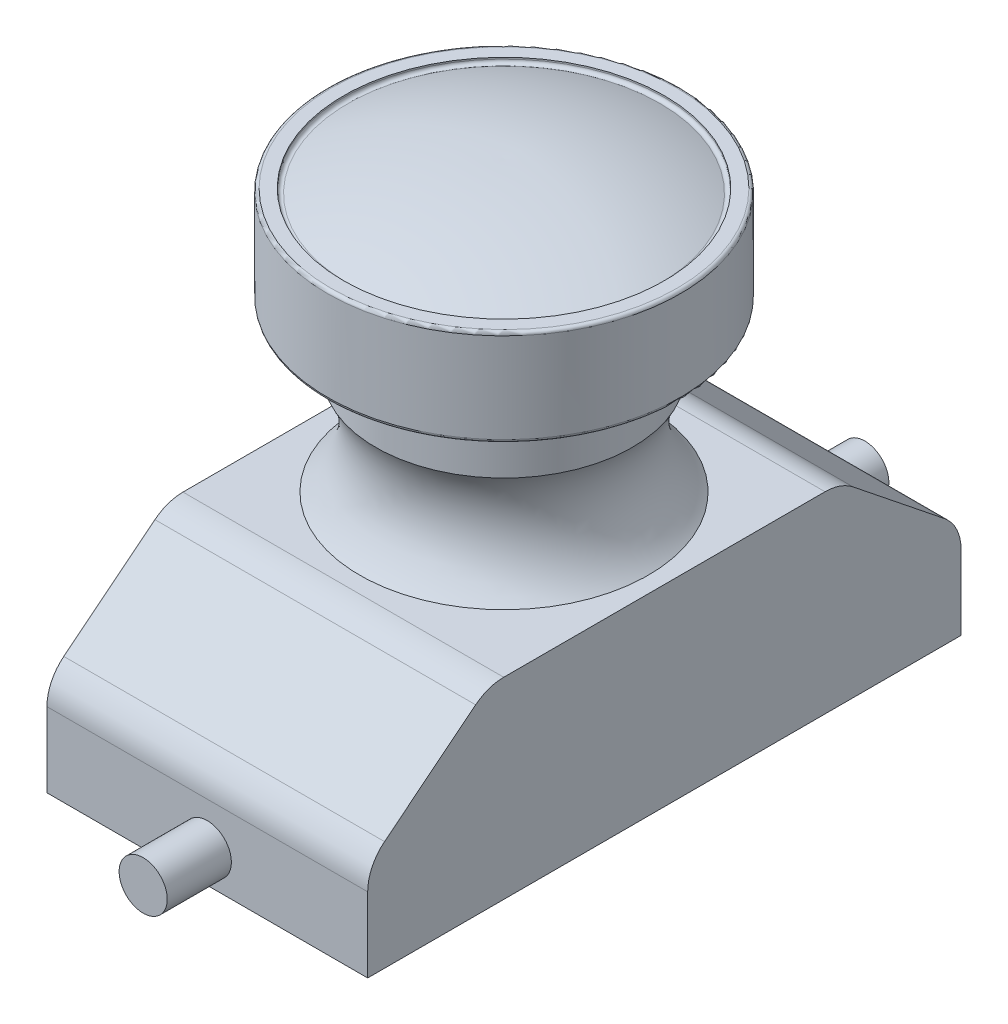
ISO-10303-21;
HEADER;
FILE_DESCRIPTION(('STEP AP214'),'2;1');
FILE_NAME('part.step','',(''),(''),'','','');
FILE_SCHEMA(('AUTOMOTIVE_DESIGN { 1 0 10303 214 1 1 1 1 }'));
ENDSEC;
DATA;
#1=APPLICATION_CONTEXT('core data for automotive mechanical design processes');
#2=APPLICATION_PROTOCOL_DEFINITION('international standard','automotive_design',2000,#1);
#3=PRODUCT_CONTEXT('',#1,'mechanical');
#4=PRODUCT('Part','Part','',(#3));
#5=PRODUCT_RELATED_PRODUCT_CATEGORY('part','',(#4));
#6=PRODUCT_DEFINITION_FORMATION('','',#4);
#7=PRODUCT_DEFINITION_CONTEXT('part definition',#1,'design');
#8=PRODUCT_DEFINITION('design','',#6,#7);
#9=PRODUCT_DEFINITION_SHAPE('','',#8);
#10=(LENGTH_UNIT() NAMED_UNIT(*) SI_UNIT(.MILLI.,.METRE.));
#11=(NAMED_UNIT(*) PLANE_ANGLE_UNIT() SI_UNIT($,.RADIAN.));
#12=(NAMED_UNIT(*) SI_UNIT($,.STERADIAN.) SOLID_ANGLE_UNIT());
#13=UNCERTAINTY_MEASURE_WITH_UNIT(LENGTH_MEASURE(1.E-05),#10,'distance_accuracy_value','');
#14=(GEOMETRIC_REPRESENTATION_CONTEXT(3) GLOBAL_UNCERTAINTY_ASSIGNED_CONTEXT((#13)) GLOBAL_UNIT_ASSIGNED_CONTEXT((#10,
#11,#12)) REPRESENTATION_CONTEXT('',''));
#15=CARTESIAN_POINT('',(0.,0.,0.));
#16=DIRECTION('',(0.,0.,1.));
#17=DIRECTION('',(1.,0.,0.));
#18=AXIS2_PLACEMENT_3D('',#15,#16,#17);
#19=CARTESIAN_POINT('',(5.,0.,0.));
#20=DIRECTION('',(0.,1.,0.));
#21=DIRECTION('',(0.,0.,1.));
#22=AXIS2_PLACEMENT_3D('',#19,#20,#21);
#23=PLANE('',#22);
#24=DIRECTION('',(0.,0.,-1.));
#25=VECTOR('',#24,1.);
#26=CARTESIAN_POINT('',(-5.,0.,0.));
#27=LINE('',#26,#25);
#28=CARTESIAN_POINT('',(-5.,0.,9.25));
#29=VERTEX_POINT('',#28);
#30=CARTESIAN_POINT('',(-5.,0.,-9.25));
#31=VERTEX_POINT('',#30);
#32=EDGE_CURVE('E206',#29,#31,#27,.T.);
#33=ORIENTED_EDGE('',*,*,#32,.T.);
#34=DIRECTION('',(-1.,0.,0.));
#35=VECTOR('',#34,1.);
#36=CARTESIAN_POINT('',(5.,0.,-9.25));
#37=LINE('',#36,#35);
#38=CARTESIAN_POINT('',(5.,0.,-9.25));
#39=VERTEX_POINT('',#38);
#40=EDGE_CURVE('E224',#39,#31,#37,.T.);
#41=ORIENTED_EDGE('',*,*,#40,.F.);
#42=DIRECTION('',(0.,0.,-1.));
#43=VECTOR('',#42,1.);
#44=CARTESIAN_POINT('',(5.,0.,0.));
#45=LINE('',#44,#43);
#46=CARTESIAN_POINT('',(5.,0.,9.25));
#47=VERTEX_POINT('',#46);
#48=EDGE_CURVE('E221',#47,#39,#45,.T.);
#49=ORIENTED_EDGE('',*,*,#48,.F.);
#50=DIRECTION('',(-1.,0.,0.));
#51=VECTOR('',#50,1.);
#52=CARTESIAN_POINT('',(5.,0.,9.25));
#53=LINE('',#52,#51);
#54=EDGE_CURVE('E199',#47,#29,#53,.T.);
#55=ORIENTED_EDGE('',*,*,#54,.T.);
#56=EDGE_LOOP('',(#33,#41,#49,#55));
#57=FACE_BOUND('',#56,.T.);
#58=ADVANCED_FACE('F34',(#57),#23,.F.);
#59=CARTESIAN_POINT('',(5.,0.,-9.25));
#60=DIRECTION('',(0.,0.,1.));
#61=DIRECTION('',(1.,0.,0.));
#62=AXIS2_PLACEMENT_3D('',#59,#60,#61);
#63=PLANE('',#62);
#64=CARTESIAN_POINT('',(0.,1.,-9.25));
#65=DIRECTION('',(0.,0.,1.));
#66=DIRECTION('',(1.,0.,0.));
#67=AXIS2_PLACEMENT_3D('',#64,#65,#66);
#68=CIRCLE('',#67,0.75);
#69=CARTESIAN_POINT('',(0.75,1.,-9.25));
#70=VERTEX_POINT('',#69);
#71=EDGE_CURVE('E11',#70,#70,#68,.F.);
#72=ORIENTED_EDGE('',*,*,#71,.F.);
#73=EDGE_LOOP('',(#72));
#74=FACE_BOUND('',#73,.T.);
#75=DIRECTION('',(0.,1.,0.));
#76=VECTOR('',#75,1.);
#77=CARTESIAN_POINT('',(-5.,0.,-9.25));
#78=LINE('',#77,#76);
#79=CARTESIAN_POINT('',(-5.,2.3271252135188,-9.25));
#80=VERTEX_POINT('',#79);
#81=EDGE_CURVE('E208',#31,#80,#78,.T.);
#82=ORIENTED_EDGE('',*,*,#81,.T.);
#83=DIRECTION('',(-1.,0.,0.));
#84=VECTOR('',#83,1.);
#85=CARTESIAN_POINT('',(5.,2.3271252135188,-9.25));
#86=LINE('',#85,#84);
#87=CARTESIAN_POINT('',(5.,2.3271252135188,-9.25));
#88=VERTEX_POINT('',#87);
#89=EDGE_CURVE('E174',#80,#88,#86,.F.);
#90=ORIENTED_EDGE('',*,*,#89,.T.);
#91=DIRECTION('',(0.,1.,0.));
#92=VECTOR('',#91,1.);
#93=CARTESIAN_POINT('',(5.,0.,-9.25));
#94=LINE('',#93,#92);
#95=EDGE_CURVE('E258',#39,#88,#94,.T.);
#96=ORIENTED_EDGE('',*,*,#95,.F.);
#97=ORIENTED_EDGE('',*,*,#40,.T.);
#98=EDGE_LOOP('',(#82,#90,#96,#97));
#99=FACE_BOUND('',#98,.T.);
#100=ADVANCED_FACE('F132',(#74,#99),#63,.F.);
#101=CARTESIAN_POINT('',(5.,6.34146341463415,-5.07317073170731));
#102=DIRECTION('',(0.,0.780868809443031,-0.624695047554424));
#103=DIRECTION('',(0.,0.624695047554424,0.780868809443031));
#104=AXIS2_PLACEMENT_3D('',#101,#102,#103);
#105=PLANE('',#104);
#106=DIRECTION('',(0.,-0.624695047554424,-0.780868809443031));
#107=VECTOR('',#106,1.);
#108=CARTESIAN_POINT('',(5.,6.34146341463415,-5.07317073170731));
#109=LINE('',#108,#107);
#110=CARTESIAN_POINT('',(5.,5.69321633322024,-5.8834795834747));
#111=VERTEX_POINT('',#110);
#112=CARTESIAN_POINT('',(5.,3.42034154673905,-8.72457306657619));
#113=VERTEX_POINT('',#112);
#114=EDGE_CURVE('E202',#111,#113,#109,.T.);
#115=ORIENTED_EDGE('',*,*,#114,.T.);
#116=DIRECTION('',(-1.,0.,0.));
#117=VECTOR('',#116,1.);
#118=CARTESIAN_POINT('',(-5.,3.42034154673905,-8.72457306657619));
#119=LINE('',#118,#117);
#120=CARTESIAN_POINT('',(-5.,3.42034154673905,-8.72457306657619));
#121=VERTEX_POINT('',#120);
#122=EDGE_CURVE('E246',#113,#121,#119,.T.);
#123=ORIENTED_EDGE('',*,*,#122,.T.);
#124=DIRECTION('',(0.,-0.624695047554424,-0.780868809443031));
#125=VECTOR('',#124,1.);
#126=CARTESIAN_POINT('',(-5.,6.34146341463415,-5.07317073170731));
#127=LINE('',#126,#125);
#128=CARTESIAN_POINT('',(-5.,5.69321633322024,-5.8834795834747));
#129=VERTEX_POINT('',#128);
#130=EDGE_CURVE('E212',#129,#121,#127,.T.);
#131=ORIENTED_EDGE('',*,*,#130,.F.);
#132=DIRECTION('',(-1.,0.,0.));
#133=VECTOR('',#132,1.);
#134=CARTESIAN_POINT('',(5.,5.69321633322024,-5.8834795834747));
#135=LINE('',#134,#133);
#136=EDGE_CURVE('E244',#129,#111,#135,.F.);
#137=ORIENTED_EDGE('',*,*,#136,.T.);
#138=EDGE_LOOP('',(#115,#123,#131,#137));
#139=FACE_BOUND('',#138,.T.);
#140=ADVANCED_FACE('F138',(#139),#105,.T.);
#141=CARTESIAN_POINT('',(5.,6.,0.));
#142=DIRECTION('',(0.,1.,0.));
#143=DIRECTION('',(0.,0.,1.));
#144=AXIS2_PLACEMENT_3D('',#141,#142,#143);
#145=PLANE('',#144);
#146=CARTESIAN_POINT('',(0.,6.,0.));
#147=DIRECTION('',(0.,-1.,0.));
#148=DIRECTION('',(0.,0.,-1.));
#149=AXIS2_PLACEMENT_3D('',#146,#147,#148);
#150=CIRCLE('',#149,4.5);
#151=CARTESIAN_POINT('',(0.,6.,-4.5));
#152=VERTEX_POINT('',#151);
#153=EDGE_CURVE('E293',#152,#152,#150,.T.);
#154=ORIENTED_EDGE('',*,*,#153,.T.);
#155=EDGE_LOOP('',(#154));
#156=FACE_BOUND('',#155,.T.);
#157=DIRECTION('',(0.,0.,-1.));
#158=VECTOR('',#157,1.);
#159=CARTESIAN_POINT('',(5.,6.,0.));
#160=LINE('',#159,#158);
#161=CARTESIAN_POINT('',(5.,6.,5.0089065168985));
#162=VERTEX_POINT('',#161);
#163=CARTESIAN_POINT('',(5.,6.,-5.0089065168985));
#164=VERTEX_POINT('',#163);
#165=EDGE_CURVE('E197',#162,#164,#160,.T.);
#166=ORIENTED_EDGE('',*,*,#165,.T.);
#167=DIRECTION('',(-1.,0.,0.));
#168=VECTOR('',#167,1.);
#169=CARTESIAN_POINT('',(5.,6.,-5.0089065168985));
#170=LINE('',#169,#168);
#171=CARTESIAN_POINT('',(-5.,6.,-5.0089065168985));
#172=VERTEX_POINT('',#171);
#173=EDGE_CURVE('E181',#164,#172,#170,.T.);
#174=ORIENTED_EDGE('',*,*,#173,.T.);
#175=DIRECTION('',(0.,0.,-1.));
#176=VECTOR('',#175,1.);
#177=CARTESIAN_POINT('',(-5.,6.,0.));
#178=LINE('',#177,#176);
#179=CARTESIAN_POINT('',(-5.,6.,5.0089065168985));
#180=VERTEX_POINT('',#179);
#181=EDGE_CURVE('E215',#180,#172,#178,.T.);
#182=ORIENTED_EDGE('',*,*,#181,.F.);
#183=DIRECTION('',(-1.,0.,0.));
#184=VECTOR('',#183,1.);
#185=CARTESIAN_POINT('',(5.,6.,5.0089065168985));
#186=LINE('',#185,#184);
#187=EDGE_CURVE('E179',#180,#162,#186,.F.);
#188=ORIENTED_EDGE('',*,*,#187,.T.);
#189=EDGE_LOOP('',(#166,#174,#182,#188));
#190=FACE_BOUND('',#189,.T.);
#191=ADVANCED_FACE('F276',(#156,#190),#145,.T.);
#192=CARTESIAN_POINT('',(5.,6.34146341463415,5.07317073170731));
#193=DIRECTION('',(0.,0.780868809443031,0.624695047554424));
#194=DIRECTION('',(0.,-0.624695047554424,0.780868809443031));
#195=AXIS2_PLACEMENT_3D('',#192,#193,#194);
#196=PLANE('',#195);
#197=DIRECTION('',(0.,0.624695047554424,-0.780868809443031));
#198=VECTOR('',#197,1.);
#199=CARTESIAN_POINT('',(-5.,6.34146341463415,5.07317073170731));
#200=LINE('',#199,#198);
#201=CARTESIAN_POINT('',(-5.,3.42034154673905,8.72457306657619));
#202=VERTEX_POINT('',#201);
#203=CARTESIAN_POINT('',(-5.,5.69321633322024,5.8834795834747));
#204=VERTEX_POINT('',#203);
#205=EDGE_CURVE('E193',#202,#204,#200,.T.);
#206=ORIENTED_EDGE('',*,*,#205,.F.);
#207=DIRECTION('',(-1.,0.,0.));
#208=VECTOR('',#207,1.);
#209=CARTESIAN_POINT('',(5.,3.42034154673905,8.72457306657619));
#210=LINE('',#209,#208);
#211=CARTESIAN_POINT('',(5.,3.42034154673905,8.72457306657619));
#212=VERTEX_POINT('',#211);
#213=EDGE_CURVE('E42',#202,#212,#210,.F.);
#214=ORIENTED_EDGE('',*,*,#213,.T.);
#215=DIRECTION('',(0.,0.624695047554424,-0.780868809443031));
#216=VECTOR('',#215,1.);
#217=CARTESIAN_POINT('',(5.,6.34146341463415,5.07317073170731));
#218=LINE('',#217,#216);
#219=CARTESIAN_POINT('',(5.,5.69321633322024,5.8834795834747));
#220=VERTEX_POINT('',#219);
#221=EDGE_CURVE('E190',#212,#220,#218,.T.);
#222=ORIENTED_EDGE('',*,*,#221,.T.);
#223=DIRECTION('',(-1.,0.,0.));
#224=VECTOR('',#223,1.);
#225=CARTESIAN_POINT('',(5.,5.69321633322024,5.8834795834747));
#226=LINE('',#225,#224);
#227=EDGE_CURVE('E185',#220,#204,#226,.T.);
#228=ORIENTED_EDGE('',*,*,#227,.T.);
#229=EDGE_LOOP('',(#206,#214,#222,#228));
#230=FACE_BOUND('',#229,.T.);
#231=ADVANCED_FACE('F189',(#230),#196,.T.);
#232=CARTESIAN_POINT('',(5.,0.,9.25));
#233=DIRECTION('',(0.,0.,-1.));
#234=DIRECTION('',(-1.,0.,0.));
#235=AXIS2_PLACEMENT_3D('',#232,#233,#234);
#236=PLANE('',#235);
#237=CARTESIAN_POINT('',(0.,1.,9.25));
#238=DIRECTION('',(0.,0.,-1.));
#239=DIRECTION('',(-1.,0.,0.));
#240=AXIS2_PLACEMENT_3D('',#237,#238,#239);
#241=CIRCLE('',#240,0.75);
#242=CARTESIAN_POINT('',(-0.75,1.,9.25));
#243=VERTEX_POINT('',#242);
#244=EDGE_CURVE('E300',#243,#243,#241,.T.);
#245=ORIENTED_EDGE('',*,*,#244,.T.);
#246=EDGE_LOOP('',(#245));
#247=FACE_BOUND('',#246,.T.);
#248=DIRECTION('',(0.,-1.,0.));
#249=VECTOR('',#248,1.);
#250=CARTESIAN_POINT('',(5.,0.,9.25));
#251=LINE('',#250,#249);
#252=CARTESIAN_POINT('',(5.,2.3271252135188,9.25));
#253=VERTEX_POINT('',#252);
#254=EDGE_CURVE('E196',#253,#47,#251,.T.);
#255=ORIENTED_EDGE('',*,*,#254,.F.);
#256=DIRECTION('',(-1.,0.,0.));
#257=VECTOR('',#256,1.);
#258=CARTESIAN_POINT('',(-5.,2.3271252135188,9.25));
#259=LINE('',#258,#257);
#260=CARTESIAN_POINT('',(-5.,2.3271252135188,9.25));
#261=VERTEX_POINT('',#260);
#262=EDGE_CURVE('E169',#253,#261,#259,.T.);
#263=ORIENTED_EDGE('',*,*,#262,.T.);
#264=DIRECTION('',(0.,-1.,0.));
#265=VECTOR('',#264,1.);
#266=CARTESIAN_POINT('',(-5.,0.,9.25));
#267=LINE('',#266,#265);
#268=EDGE_CURVE('E219',#261,#29,#267,.T.);
#269=ORIENTED_EDGE('',*,*,#268,.T.);
#270=ORIENTED_EDGE('',*,*,#54,.F.);
#271=EDGE_LOOP('',(#255,#263,#269,#270));
#272=FACE_BOUND('',#271,.T.);
#273=ADVANCED_FACE('F281',(#247,#272),#236,.F.);
#274=CARTESIAN_POINT('',(5.,0.,0.));
#275=DIRECTION('',(1.,0.,0.));
#276=DIRECTION('',(0.,0.,-1.));
#277=AXIS2_PLACEMENT_3D('',#274,#275,#276);
#278=PLANE('',#277);
#279=ORIENTED_EDGE('',*,*,#95,.T.);
#280=CARTESIAN_POINT('',(5.,2.3271252135188,-7.85));
#281=DIRECTION('',(1.,0.,0.));
#282=DIRECTION('',(0.,0.,-1.));
#283=AXIS2_PLACEMENT_3D('',#280,#281,#282);
#284=CIRCLE('',#283,1.4);
#285=EDGE_CURVE('E172',#88,#113,#284,.T.);
#286=ORIENTED_EDGE('',*,*,#285,.T.);
#287=ORIENTED_EDGE('',*,*,#114,.F.);
#288=CARTESIAN_POINT('',(5.,4.6,-5.0089065168985));
#289=DIRECTION('',(1.,0.,0.));
#290=DIRECTION('',(0.,0.,-1.));
#291=AXIS2_PLACEMENT_3D('',#288,#289,#290);
#292=CIRCLE('',#291,1.4);
#293=EDGE_CURVE('E170',#111,#164,#292,.T.);
#294=ORIENTED_EDGE('',*,*,#293,.T.);
#295=ORIENTED_EDGE('',*,*,#165,.F.);
#296=CARTESIAN_POINT('',(5.,4.6,5.0089065168985));
#297=DIRECTION('',(1.,0.,0.));
#298=DIRECTION('',(0.,0.,-1.));
#299=AXIS2_PLACEMENT_3D('',#296,#297,#298);
#300=CIRCLE('',#299,1.4);
#301=EDGE_CURVE('E55',#162,#220,#300,.T.);
#302=ORIENTED_EDGE('',*,*,#301,.T.);
#303=ORIENTED_EDGE('',*,*,#221,.F.);
#304=CARTESIAN_POINT('',(5.,2.3271252135188,7.85));
#305=DIRECTION('',(1.,0.,0.));
#306=DIRECTION('',(0.,0.,-1.));
#307=AXIS2_PLACEMENT_3D('',#304,#305,#306);
#308=CIRCLE('',#307,1.4);
#309=EDGE_CURVE('E49',#212,#253,#308,.T.);
#310=ORIENTED_EDGE('',*,*,#309,.T.);
#311=ORIENTED_EDGE('',*,*,#254,.T.);
#312=ORIENTED_EDGE('',*,*,#48,.T.);
#313=EDGE_LOOP('',(#279,#286,#287,#294,#295,#302,#303,#310,#311,#312));
#314=FACE_BOUND('',#313,.T.);
#315=ADVANCED_FACE('F195',(#314),#278,.T.);
#316=CARTESIAN_POINT('',(-5.,0.,0.));
#317=DIRECTION('',(1.,0.,0.));
#318=DIRECTION('',(0.,0.,-1.));
#319=AXIS2_PLACEMENT_3D('',#316,#317,#318);
#320=PLANE('',#319);
#321=ORIENTED_EDGE('',*,*,#130,.T.);
#322=CARTESIAN_POINT('',(-5.,2.3271252135188,-7.85));
#323=DIRECTION('',(1.,0.,0.));
#324=DIRECTION('',(0.,0.,-1.));
#325=AXIS2_PLACEMENT_3D('',#322,#323,#324);
#326=CIRCLE('',#325,1.4);
#327=EDGE_CURVE('E255',#121,#80,#326,.F.);
#328=ORIENTED_EDGE('',*,*,#327,.T.);
#329=ORIENTED_EDGE('',*,*,#81,.F.);
#330=ORIENTED_EDGE('',*,*,#32,.F.);
#331=ORIENTED_EDGE('',*,*,#268,.F.);
#332=CARTESIAN_POINT('',(-5.,2.3271252135188,7.85));
#333=DIRECTION('',(1.,0.,0.));
#334=DIRECTION('',(0.,0.,-1.));
#335=AXIS2_PLACEMENT_3D('',#332,#333,#334);
#336=CIRCLE('',#335,1.4);
#337=EDGE_CURVE('E251',#261,#202,#336,.F.);
#338=ORIENTED_EDGE('',*,*,#337,.T.);
#339=ORIENTED_EDGE('',*,*,#205,.T.);
#340=CARTESIAN_POINT('',(-5.,4.6,5.0089065168985));
#341=DIRECTION('',(1.,0.,0.));
#342=DIRECTION('',(0.,0.,-1.));
#343=AXIS2_PLACEMENT_3D('',#340,#341,#342);
#344=CIRCLE('',#343,1.4);
#345=EDGE_CURVE('E249',#204,#180,#344,.F.);
#346=ORIENTED_EDGE('',*,*,#345,.T.);
#347=ORIENTED_EDGE('',*,*,#181,.T.);
#348=CARTESIAN_POINT('',(-5.,4.6,-5.0089065168985));
#349=DIRECTION('',(1.,0.,0.));
#350=DIRECTION('',(0.,0.,-1.));
#351=AXIS2_PLACEMENT_3D('',#348,#349,#350);
#352=CIRCLE('',#351,1.4);
#353=EDGE_CURVE('E253',#172,#129,#352,.F.);
#354=ORIENTED_EDGE('',*,*,#353,.T.);
#355=EDGE_LOOP('',(#321,#328,#329,#330,#331,#338,#339,#346,#347,#354));
#356=FACE_BOUND('',#355,.T.);
#357=ADVANCED_FACE('F271',(#356),#320,.F.);
#358=CARTESIAN_POINT('',(0.,6.,0.));
#359=DIRECTION('',(0.,-1.,0.));
#360=DIRECTION('',(0.,0.,-1.));
#361=AXIS2_PLACEMENT_3D('',#358,#359,#360);
#362=CYLINDRICAL_SURFACE('',#361,5.);
#363=CARTESIAN_POINT('',(0.,14.151701238125,0.));
#364=DIRECTION('',(0.,1.,0.));
#365=DIRECTION('',(0.,0.,1.));
#366=AXIS2_PLACEMENT_3D('',#363,#364,#365);
#367=CIRCLE('',#366,5.);
#368=CARTESIAN_POINT('',(0.,14.151701238125,5.));
#369=VERTEX_POINT('',#368);
#370=EDGE_CURVE('E241',#369,#369,#367,.F.);
#371=ORIENTED_EDGE('',*,*,#370,.T.);
#372=EDGE_LOOP('',(#371));
#373=FACE_BOUND('',#372,.T.);
#374=CARTESIAN_POINT('',(0.,14.2,0.));
#375=DIRECTION('',(0.,-1.,0.));
#376=DIRECTION('',(0.,0.,-1.));
#377=AXIS2_PLACEMENT_3D('',#374,#375,#376);
#378=CIRCLE('',#377,5.);
#379=CARTESIAN_POINT('',(0.,14.2,-5.));
#380=VERTEX_POINT('',#379);
#381=EDGE_CURVE('E209',#380,#380,#378,.T.);
#382=ORIENTED_EDGE('',*,*,#381,.F.);
#383=EDGE_LOOP('',(#382));
#384=FACE_BOUND('',#383,.T.);
#385=ADVANCED_FACE('F371',(#373,#384),#362,.F.);
#386=CARTESIAN_POINT('',(0.,14.2,-5.));
#387=DIRECTION('',(0.,1.,0.));
#388=DIRECTION('',(0.,0.,1.));
#389=AXIS2_PLACEMENT_3D('',#386,#387,#388);
#390=PLANE('',#389);
#391=CARTESIAN_POINT('',(0.,14.2,0.));
#392=DIRECTION('',(0.,1.,0.));
#393=DIRECTION('',(0.,0.,1.));
#394=AXIS2_PLACEMENT_3D('',#391,#392,#393);
#395=CIRCLE('',#394,5.4);
#396=CARTESIAN_POINT('',(0.,14.2,5.4));
#397=VERTEX_POINT('',#396);
#398=EDGE_CURVE('E236',#397,#397,#395,.T.);
#399=ORIENTED_EDGE('',*,*,#398,.T.);
#400=EDGE_LOOP('',(#399));
#401=FACE_BOUND('',#400,.T.);
#402=ORIENTED_EDGE('',*,*,#381,.T.);
#403=EDGE_LOOP('',(#402));
#404=FACE_BOUND('',#403,.T.);
#405=ADVANCED_FACE('F379',(#401,#404),#390,.T.);
#406=CARTESIAN_POINT('',(0.,6.,0.));
#407=DIRECTION('',(0.,-1.,0.));
#408=DIRECTION('',(0.,0.,-1.));
#409=AXIS2_PLACEMENT_3D('',#406,#407,#408);
#410=CYLINDRICAL_SURFACE('',#409,5.5);
#411=CARTESIAN_POINT('',(0.,11.3,0.));
#412=DIRECTION('',(0.,-1.,0.));
#413=DIRECTION('',(0.,0.,-1.));
#414=AXIS2_PLACEMENT_3D('',#411,#412,#413);
#415=CIRCLE('',#414,5.5);
#416=CARTESIAN_POINT('',(0.,11.3,-5.5));
#417=VERTEX_POINT('',#416);
#418=EDGE_CURVE('E233',#417,#417,#415,.F.);
#419=ORIENTED_EDGE('',*,*,#418,.T.);
#420=EDGE_LOOP('',(#419));
#421=FACE_BOUND('',#420,.T.);
#422=CARTESIAN_POINT('',(0.,14.1,0.));
#423=DIRECTION('',(0.,1.,0.));
#424=DIRECTION('',(0.,0.,1.));
#425=AXIS2_PLACEMENT_3D('',#422,#423,#424);
#426=CIRCLE('',#425,5.5);
#427=CARTESIAN_POINT('',(0.,14.1,5.5));
#428=VERTEX_POINT('',#427);
#429=EDGE_CURVE('E230',#428,#428,#426,.F.);
#430=ORIENTED_EDGE('',*,*,#429,.T.);
#431=EDGE_LOOP('',(#430));
#432=FACE_BOUND('',#431,.T.);
#433=ADVANCED_FACE('F388',(#421,#432),#410,.T.);
#434=CARTESIAN_POINT('',(0.,11.2,-5.5));
#435=DIRECTION('',(0.,-1.,0.));
#436=DIRECTION('',(0.,0.,-1.));
#437=AXIS2_PLACEMENT_3D('',#434,#435,#436);
#438=PLANE('',#437);
#439=CARTESIAN_POINT('',(0.,11.2,0.));
#440=DIRECTION('',(0.,-1.,0.));
#441=DIRECTION('',(0.,0.,-1.));
#442=AXIS2_PLACEMENT_3D('',#439,#440,#441);
#443=CIRCLE('',#442,5.4);
#444=CARTESIAN_POINT('',(0.,11.2,-5.4));
#445=VERTEX_POINT('',#444);
#446=EDGE_CURVE('E227',#445,#445,#443,.T.);
#447=ORIENTED_EDGE('',*,*,#446,.T.);
#448=EDGE_LOOP('',(#447));
#449=FACE_BOUND('',#448,.T.);
#450=CARTESIAN_POINT('',(0.,11.2,0.));
#451=DIRECTION('',(0.,-1.,0.));
#452=DIRECTION('',(0.,0.,-1.));
#453=AXIS2_PLACEMENT_3D('',#450,#451,#452);
#454=CIRCLE('',#453,4.);
#455=CARTESIAN_POINT('',(0.,11.2,-4.));
#456=VERTEX_POINT('',#455);
#457=EDGE_CURVE('E287',#456,#456,#454,.T.);
#458=ORIENTED_EDGE('',*,*,#457,.F.);
#459=EDGE_LOOP('',(#458));
#460=FACE_BOUND('',#459,.T.);
#461=ADVANCED_FACE('F397',(#449,#460),#438,.T.);
#462=CARTESIAN_POINT('',(0.,6.,0.));
#463=DIRECTION('',(0.,-1.,0.));
#464=DIRECTION('',(0.,0.,-1.));
#465=AXIS2_PLACEMENT_3D('',#462,#463,#464);
#466=CYLINDRICAL_SURFACE('',#465,4.);
#467=ORIENTED_EDGE('',*,*,#457,.T.);
#468=EDGE_LOOP('',(#467));
#469=FACE_BOUND('',#468,.T.);
#470=CARTESIAN_POINT('',(0.,9.2,0.));
#471=DIRECTION('',(0.,-1.,0.));
#472=DIRECTION('',(0.,0.,-1.));
#473=AXIS2_PLACEMENT_3D('',#470,#471,#472);
#474=CIRCLE('',#473,4.);
#475=CARTESIAN_POINT('',(0.,9.2,-4.));
#476=VERTEX_POINT('',#475);
#477=EDGE_CURVE('E290',#476,#476,#474,.T.);
#478=ORIENTED_EDGE('',*,*,#477,.F.);
#479=EDGE_LOOP('',(#478));
#480=FACE_BOUND('',#479,.T.);
#481=ADVANCED_FACE('F126',(#469,#480),#466,.T.);
#482=CARTESIAN_POINT('',(0.,7.89402615915735,0.));
#483=DIRECTION('',(0.,-1.,0.));
#484=DIRECTION('',(0.,0.,-1.));
#485=AXIS2_PLACEMENT_3D('',#482,#483,#484);
#486=TOROIDAL_SURFACE('',#485,6.13176741860708,2.5);
#487=ORIENTED_EDGE('',*,*,#477,.T.);
#488=EDGE_LOOP('',(#487));
#489=FACE_BOUND('',#488,.T.);
#490=ORIENTED_EDGE('',*,*,#153,.F.);
#491=EDGE_LOOP('',(#490));
#492=FACE_BOUND('',#491,.T.);
#493=ADVANCED_FACE('F116',(#489,#492),#486,.F.);
#494=CARTESIAN_POINT('',(0.,3.0016723624025,0.200334472480498));
#495=DIRECTION('',(-1.,0.,0.));
#496=DIRECTION('',(0.,0.,1.));
#497=AXIS2_PLACEMENT_3D('',#494,#495,#496);
#498=CIRCLE('',#497,12.);
#499=TRIMMED_CURVE('',#498,(PARAMETER_VALUE(-1.58749164174817)),
(PARAMETER_VALUE(1.58749164174817)),.T.,.PARAMETER.);
#500=CARTESIAN_POINT('',(0.,3.0016723624025,0.));
#501=DIRECTION('',(0.,1.,0.));
#502=AXIS1_PLACEMENT('',#500,#501);
#503=SURFACE_OF_REVOLUTION('',#499,#502);
#504=CARTESIAN_POINT('',(0.,14.0595522391521,0.));
#505=DIRECTION('',(0.,-1.,0.));
#506=DIRECTION('',(0.,0.,-1.));
#507=AXIS2_PLACEMENT_3D('',#504,#505,#506);
#508=CIRCLE('',#507,4.86115978902876);
#509=CARTESIAN_POINT('',(0.,14.0595522391521,-4.86115978902877));
#510=VERTEX_POINT('',#509);
#511=EDGE_CURVE('E239',#510,#510,#508,.F.);
#512=ORIENTED_EDGE('',*,*,#511,.T.);
#513=EDGE_LOOP('',(#512));
#514=FACE_BOUND('',#513,.T.);
#515=CARTESIAN_POINT('',(0.,15.,0.));
#516=VERTEX_POINT('',#515);
#517=VERTEX_LOOP('',#516);
#518=FACE_BOUND('',#517,.T.);
#519=ADVANCED_FACE('F113',(#514,#518),#503,.T.);
#520=CARTESIAN_POINT('',(0.,11.3,0.));
#521=DIRECTION('',(0.,-1.,0.));
#522=DIRECTION('',(0.,0.,-1.));
#523=AXIS2_PLACEMENT_3D('',#520,#521,#522);
#524=TOROIDAL_SURFACE('',#523,5.4,0.1);
#525=ORIENTED_EDGE('',*,*,#418,.F.);
#526=EDGE_LOOP('',(#525));
#527=FACE_BOUND('',#526,.T.);
#528=ORIENTED_EDGE('',*,*,#446,.F.);
#529=EDGE_LOOP('',(#528));
#530=FACE_BOUND('',#529,.T.);
#531=ADVANCED_FACE('F115',(#527,#530),#524,.T.);
#532=CARTESIAN_POINT('',(0.,14.1,0.));
#533=DIRECTION('',(0.,1.,0.));
#534=DIRECTION('',(0.,0.,1.));
#535=AXIS2_PLACEMENT_3D('',#532,#533,#534);
#536=TOROIDAL_SURFACE('',#535,5.4,0.1);
#537=ORIENTED_EDGE('',*,*,#398,.F.);
#538=EDGE_LOOP('',(#537));
#539=FACE_BOUND('',#538,.T.);
#540=ORIENTED_EDGE('',*,*,#429,.F.);
#541=EDGE_LOOP('',(#540));
#542=FACE_BOUND('',#541,.T.);
#543=ADVANCED_FACE('F123',(#539,#542),#536,.T.);
#544=CARTESIAN_POINT('',(0.,14.151701238125,0.));
#545=DIRECTION('',(0.,1.,0.));
#546=DIRECTION('',(0.,0.,1.));
#547=AXIS2_PLACEMENT_3D('',#544,#545,#546);
#548=TOROIDAL_SURFACE('',#547,4.9,0.1);
#549=ORIENTED_EDGE('',*,*,#370,.F.);
#550=EDGE_LOOP('',(#549));
#551=FACE_BOUND('',#550,.T.);
#552=ORIENTED_EDGE('',*,*,#511,.F.);
#553=EDGE_LOOP('',(#552));
#554=FACE_BOUND('',#553,.T.);
#555=ADVANCED_FACE('F146',(#551,#554),#548,.F.);
#556=CARTESIAN_POINT('',(5.,2.3271252135188,-7.85));
#557=DIRECTION('',(1.,0.,0.));
#558=DIRECTION('',(0.,0.,-1.));
#559=AXIS2_PLACEMENT_3D('',#556,#557,#558);
#560=CYLINDRICAL_SURFACE('',#559,1.4);
#561=ORIENTED_EDGE('',*,*,#285,.F.);
#562=ORIENTED_EDGE('',*,*,#89,.F.);
#563=ORIENTED_EDGE('',*,*,#327,.F.);
#564=ORIENTED_EDGE('',*,*,#122,.F.);
#565=EDGE_LOOP('',(#561,#562,#563,#564));
#566=FACE_BOUND('',#565,.T.);
#567=ADVANCED_FACE('F150',(#566),#560,.T.);
#568=CARTESIAN_POINT('',(5.,4.6,-5.0089065168985));
#569=DIRECTION('',(-1.,0.,0.));
#570=DIRECTION('',(0.,0.,1.));
#571=AXIS2_PLACEMENT_3D('',#568,#569,#570);
#572=CYLINDRICAL_SURFACE('',#571,1.4);
#573=ORIENTED_EDGE('',*,*,#293,.F.);
#574=ORIENTED_EDGE('',*,*,#136,.F.);
#575=ORIENTED_EDGE('',*,*,#353,.F.);
#576=ORIENTED_EDGE('',*,*,#173,.F.);
#577=EDGE_LOOP('',(#573,#574,#575,#576));
#578=FACE_BOUND('',#577,.T.);
#579=ADVANCED_FACE('F154',(#578),#572,.T.);
#580=CARTESIAN_POINT('',(5.,2.3271252135188,7.85));
#581=DIRECTION('',(1.,0.,0.));
#582=DIRECTION('',(0.,0.,-1.));
#583=AXIS2_PLACEMENT_3D('',#580,#581,#582);
#584=CYLINDRICAL_SURFACE('',#583,1.4);
#585=ORIENTED_EDGE('',*,*,#309,.F.);
#586=ORIENTED_EDGE('',*,*,#213,.F.);
#587=ORIENTED_EDGE('',*,*,#337,.F.);
#588=ORIENTED_EDGE('',*,*,#262,.F.);
#589=EDGE_LOOP('',(#585,#586,#587,#588));
#590=FACE_BOUND('',#589,.T.);
#591=ADVANCED_FACE('F157',(#590),#584,.T.);
#592=CARTESIAN_POINT('',(5.,4.6,5.0089065168985));
#593=DIRECTION('',(-1.,0.,0.));
#594=DIRECTION('',(0.,0.,1.));
#595=AXIS2_PLACEMENT_3D('',#592,#593,#594);
#596=CYLINDRICAL_SURFACE('',#595,1.4);
#597=ORIENTED_EDGE('',*,*,#301,.F.);
#598=ORIENTED_EDGE('',*,*,#187,.F.);
#599=ORIENTED_EDGE('',*,*,#345,.F.);
#600=ORIENTED_EDGE('',*,*,#227,.F.);
#601=EDGE_LOOP('',(#597,#598,#599,#600));
#602=FACE_BOUND('',#601,.T.);
#603=ADVANCED_FACE('F36',(#602),#596,.T.);
#604=CARTESIAN_POINT('',(0.,1.,-11.25));
#605=DIRECTION('',(0.,0.,1.));
#606=DIRECTION('',(1.,0.,0.));
#607=AXIS2_PLACEMENT_3D('',#604,#605,#606);
#608=CYLINDRICAL_SURFACE('',#607,0.75);
#609=CARTESIAN_POINT('',(0.,1.,-11.25));
#610=DIRECTION('',(0.,0.,-1.));
#611=DIRECTION('',(-1.,0.,0.));
#612=AXIS2_PLACEMENT_3D('',#609,#610,#611);
#613=CIRCLE('',#612,0.75);
#614=CARTESIAN_POINT('',(-0.75,1.,-11.25));
#615=VERTEX_POINT('',#614);
#616=EDGE_CURVE('E296',#615,#615,#613,.T.);
#617=ORIENTED_EDGE('',*,*,#616,.F.);
#618=EDGE_LOOP('',(#617));
#619=FACE_BOUND('',#618,.T.);
#620=ORIENTED_EDGE('',*,*,#71,.T.);
#621=EDGE_LOOP('',(#620));
#622=FACE_BOUND('',#621,.T.);
#623=ADVANCED_FACE('F164',(#619,#622),#608,.T.);
#624=CARTESIAN_POINT('',(0.,1.,-11.25));
#625=DIRECTION('',(0.,0.,-1.));
#626=DIRECTION('',(-1.,0.,0.));
#627=AXIS2_PLACEMENT_3D('',#624,#625,#626);
#628=PLANE('',#627);
#629=ORIENTED_EDGE('',*,*,#616,.T.);
#630=EDGE_LOOP('',(#629));
#631=FACE_BOUND('',#630,.T.);
#632=ADVANCED_FACE('F315',(#631),#628,.T.);
#633=CARTESIAN_POINT('',(0.,1.,11.25));
#634=DIRECTION('',(0.,0.,-1.));
#635=DIRECTION('',(-1.,0.,0.));
#636=AXIS2_PLACEMENT_3D('',#633,#634,#635);
#637=CYLINDRICAL_SURFACE('',#636,0.75);
#638=CARTESIAN_POINT('',(0.,1.,11.25));
#639=DIRECTION('',(0.,0.,-1.));
#640=DIRECTION('',(-1.,0.,0.));
#641=AXIS2_PLACEMENT_3D('',#638,#639,#640);
#642=CIRCLE('',#641,0.75);
#643=CARTESIAN_POINT('',(-0.75,1.,11.25));
#644=VERTEX_POINT('',#643);
#645=EDGE_CURVE('E299',#644,#644,#642,.T.);
#646=ORIENTED_EDGE('',*,*,#645,.T.);
#647=EDGE_LOOP('',(#646));
#648=FACE_BOUND('',#647,.T.);
#649=ORIENTED_EDGE('',*,*,#244,.F.);
#650=EDGE_LOOP('',(#649));
#651=FACE_BOUND('',#650,.T.);
#652=ADVANCED_FACE('F306',(#648,#651),#637,.T.);
#653=CARTESIAN_POINT('',(0.,1.,11.25));
#654=DIRECTION('',(0.,0.,1.));
#655=DIRECTION('',(-1.,0.,0.));
#656=AXIS2_PLACEMENT_3D('',#653,#654,#655);
#657=PLANE('',#656);
#658=ORIENTED_EDGE('',*,*,#645,.F.);
#659=EDGE_LOOP('',(#658));
#660=FACE_BOUND('',#659,.T.);
#661=ADVANCED_FACE('F309',(#660),#657,.T.);
#662=CLOSED_SHELL('',(#58,#100,#140,#191,#231,#273,#315,#357,#385,#405,#433,#461,#481,#493,#519,
#531,#543,#555,#567,#579,#591,#603,#623,#632,#652,#661));
#663=MANIFOLD_SOLID_BREP('B2',#662);
#664=ADVANCED_BREP_SHAPE_REPRESENTATION('',(#18,#663),#14);
#665=SHAPE_DEFINITION_REPRESENTATION(#9,#664);
ENDSEC;
END-ISO-10303-21;
